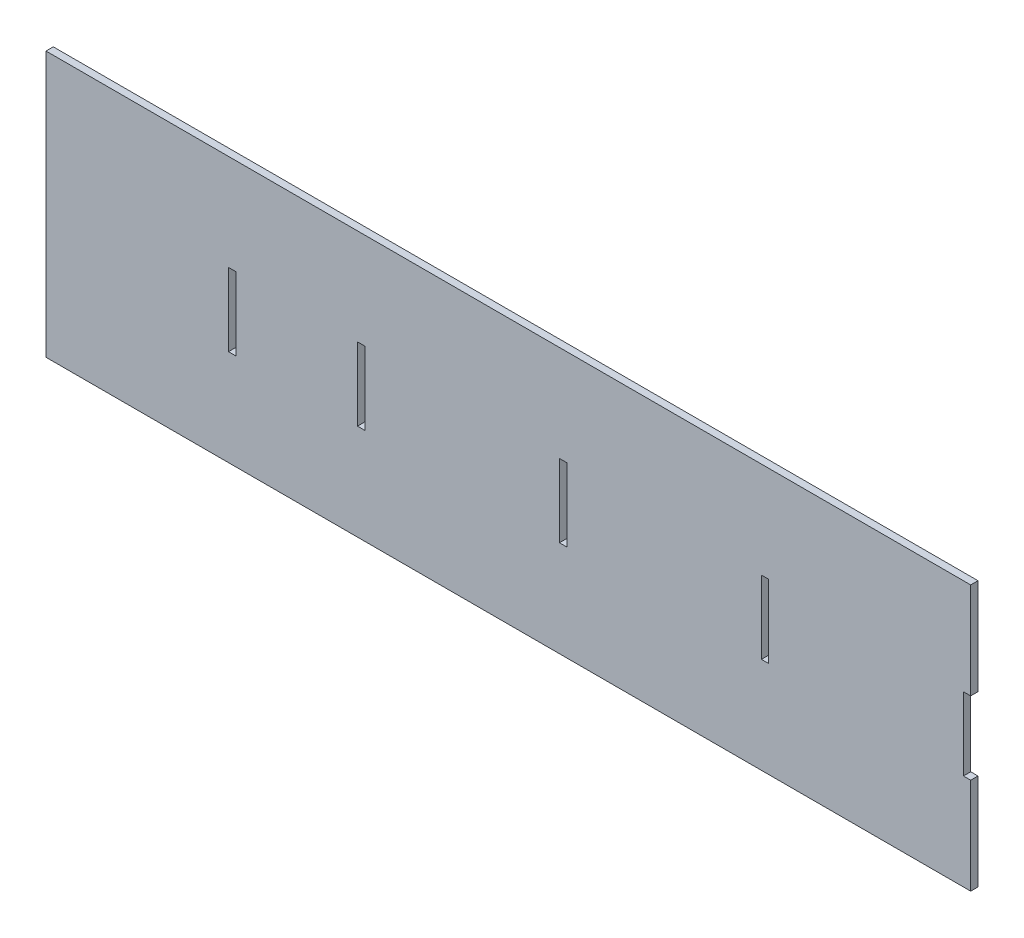
ISO-10303-21;
HEADER;
FILE_DESCRIPTION(('STEP AP214'),'2;1');
FILE_NAME('part.step','',(''),(''),'','','');
FILE_SCHEMA(('AUTOMOTIVE_DESIGN { 1 0 10303 214 1 1 1 1 }'));
ENDSEC;
DATA;
#1=APPLICATION_CONTEXT('core data for automotive mechanical design processes');
#2=APPLICATION_PROTOCOL_DEFINITION('international standard','automotive_design',2000,#1);
#3=PRODUCT_CONTEXT('',#1,'mechanical');
#4=PRODUCT('Part','Part','',(#3));
#5=PRODUCT_RELATED_PRODUCT_CATEGORY('part','',(#4));
#6=PRODUCT_DEFINITION_FORMATION('','',#4);
#7=PRODUCT_DEFINITION_CONTEXT('part definition',#1,'design');
#8=PRODUCT_DEFINITION('design','',#6,#7);
#9=PRODUCT_DEFINITION_SHAPE('','',#8);
#10=(LENGTH_UNIT() NAMED_UNIT(*) SI_UNIT(.MILLI.,.METRE.));
#11=(NAMED_UNIT(*) PLANE_ANGLE_UNIT() SI_UNIT($,.RADIAN.));
#12=(NAMED_UNIT(*) SI_UNIT($,.STERADIAN.) SOLID_ANGLE_UNIT());
#13=UNCERTAINTY_MEASURE_WITH_UNIT(LENGTH_MEASURE(1.E-05),#10,'distance_accuracy_value','');
#14=(GEOMETRIC_REPRESENTATION_CONTEXT(3) GLOBAL_UNCERTAINTY_ASSIGNED_CONTEXT((#13)) GLOBAL_UNIT_ASSIGNED_CONTEXT((#10,
#11,#12)) REPRESENTATION_CONTEXT('',''));
#15=CARTESIAN_POINT('',(0.,0.,0.));
#16=DIRECTION('',(0.,0.,1.));
#17=DIRECTION('',(1.,0.,0.));
#18=AXIS2_PLACEMENT_3D('',#15,#16,#17);
#19=CARTESIAN_POINT('',(0.,0.,3.));
#20=DIRECTION('',(0.,0.,-1.));
#21=DIRECTION('',(-1.,0.,0.));
#22=AXIS2_PLACEMENT_3D('',#19,#20,#21);
#23=PLANE('',#22);
#24=DIRECTION('',(0.,-1.,0.));
#25=VECTOR('',#24,1.);
#26=CARTESIAN_POINT('',(294.,69.5,3.));
#27=LINE('',#26,#25);
#28=CARTESIAN_POINT('',(294.,69.5,3.));
#29=VERTEX_POINT('',#28);
#30=CARTESIAN_POINT('',(294.,39.5,3.));
#31=VERTEX_POINT('',#30);
#32=EDGE_CURVE('E234',#29,#31,#27,.T.);
#33=ORIENTED_EDGE('',*,*,#32,.F.);
#34=DIRECTION('',(-1.,0.,0.));
#35=VECTOR('',#34,1.);
#36=CARTESIAN_POINT('',(294.,69.5,3.));
#37=LINE('',#36,#35);
#38=CARTESIAN_POINT('',(297.,69.5,3.));
#39=VERTEX_POINT('',#38);
#40=EDGE_CURVE('E242',#39,#29,#37,.T.);
#41=ORIENTED_EDGE('',*,*,#40,.F.);
#42=DIRECTION('',(0.,1.,0.));
#43=VECTOR('',#42,1.);
#44=CARTESIAN_POINT('',(297.,69.5,3.));
#45=LINE('',#44,#43);
#46=CARTESIAN_POINT('',(297.,39.5,3.));
#47=VERTEX_POINT('',#46);
#48=EDGE_CURVE('E239',#47,#39,#45,.T.);
#49=ORIENTED_EDGE('',*,*,#48,.F.);
#50=DIRECTION('',(1.,0.,0.));
#51=VECTOR('',#50,1.);
#52=CARTESIAN_POINT('',(294.,39.5,3.));
#53=LINE('',#52,#51);
#54=EDGE_CURVE('E236',#31,#47,#53,.T.);
#55=ORIENTED_EDGE('',*,*,#54,.F.);
#56=EDGE_LOOP('',(#33,#41,#49,#55));
#57=FACE_BOUND('',#56,.T.);
#58=DIRECTION('',(0.,-1.,0.));
#59=VECTOR('',#58,1.);
#60=CARTESIAN_POINT('',(75.,69.5,3.));
#61=LINE('',#60,#59);
#62=CARTESIAN_POINT('',(75.,69.5,3.));
#63=VERTEX_POINT('',#62);
#64=CARTESIAN_POINT('',(75.,39.5,3.));
#65=VERTEX_POINT('',#64);
#66=EDGE_CURVE('E296',#63,#65,#61,.T.);
#67=ORIENTED_EDGE('',*,*,#66,.F.);
#68=DIRECTION('',(-1.,0.,0.));
#69=VECTOR('',#68,1.);
#70=CARTESIAN_POINT('',(75.,69.5,3.));
#71=LINE('',#70,#69);
#72=CARTESIAN_POINT('',(78.,69.5,3.));
#73=VERTEX_POINT('',#72);
#74=EDGE_CURVE('E304',#73,#63,#71,.T.);
#75=ORIENTED_EDGE('',*,*,#74,.F.);
#76=DIRECTION('',(0.,1.,0.));
#77=VECTOR('',#76,1.);
#78=CARTESIAN_POINT('',(78.,69.5,3.));
#79=LINE('',#78,#77);
#80=CARTESIAN_POINT('',(78.,39.5,3.));
#81=VERTEX_POINT('',#80);
#82=EDGE_CURVE('E301',#81,#73,#79,.T.);
#83=ORIENTED_EDGE('',*,*,#82,.F.);
#84=DIRECTION('',(1.,0.,0.));
#85=VECTOR('',#84,1.);
#86=CARTESIAN_POINT('',(75.,39.5,3.));
#87=LINE('',#86,#85);
#88=EDGE_CURVE('E298',#65,#81,#87,.T.);
#89=ORIENTED_EDGE('',*,*,#88,.F.);
#90=EDGE_LOOP('',(#67,#75,#83,#89));
#91=FACE_BOUND('',#90,.T.);
#92=DIRECTION('',(0.,-1.,0.));
#93=VECTOR('',#92,1.);
#94=CARTESIAN_POINT('',(0.,0.,3.));
#95=LINE('',#94,#93);
#96=CARTESIAN_POINT('',(0.,109.,3.));
#97=VERTEX_POINT('',#96);
#98=CARTESIAN_POINT('',(0.,0.,3.));
#99=VERTEX_POINT('',#98);
#100=EDGE_CURVE('E327',#97,#99,#95,.T.);
#101=ORIENTED_EDGE('',*,*,#100,.T.);
#102=DIRECTION('',(1.,0.,0.));
#103=VECTOR('',#102,1.);
#104=CARTESIAN_POINT('',(380.,0.,3.));
#105=LINE('',#104,#103);
#106=CARTESIAN_POINT('',(380.,0.,3.));
#107=VERTEX_POINT('',#106);
#108=EDGE_CURVE('E330',#99,#107,#105,.T.);
#109=ORIENTED_EDGE('',*,*,#108,.T.);
#110=DIRECTION('',(0.,1.,0.));
#111=VECTOR('',#110,1.);
#112=CARTESIAN_POINT('',(380.,39.5,3.));
#113=LINE('',#112,#111);
#114=CARTESIAN_POINT('',(380.,39.5,3.));
#115=VERTEX_POINT('',#114);
#116=EDGE_CURVE('E333',#107,#115,#113,.T.);
#117=ORIENTED_EDGE('',*,*,#116,.T.);
#118=DIRECTION('',(-1.,0.,0.));
#119=VECTOR('',#118,1.);
#120=CARTESIAN_POINT('',(377.,39.5,3.));
#121=LINE('',#120,#119);
#122=CARTESIAN_POINT('',(377.,39.5,3.));
#123=VERTEX_POINT('',#122);
#124=EDGE_CURVE('E335',#115,#123,#121,.T.);
#125=ORIENTED_EDGE('',*,*,#124,.T.);
#126=DIRECTION('',(0.,1.,0.));
#127=VECTOR('',#126,1.);
#128=CARTESIAN_POINT('',(377.,69.5,3.));
#129=LINE('',#128,#127);
#130=CARTESIAN_POINT('',(377.,69.5,3.));
#131=VERTEX_POINT('',#130);
#132=EDGE_CURVE('E337',#123,#131,#129,.T.);
#133=ORIENTED_EDGE('',*,*,#132,.T.);
#134=DIRECTION('',(1.,0.,0.));
#135=VECTOR('',#134,1.);
#136=CARTESIAN_POINT('',(377.,69.5,3.));
#137=LINE('',#136,#135);
#138=CARTESIAN_POINT('',(380.,69.5,3.));
#139=VERTEX_POINT('',#138);
#140=EDGE_CURVE('E339',#131,#139,#137,.T.);
#141=ORIENTED_EDGE('',*,*,#140,.T.);
#142=DIRECTION('',(0.,1.,0.));
#143=VECTOR('',#142,1.);
#144=CARTESIAN_POINT('',(380.,69.5,3.));
#145=LINE('',#144,#143);
#146=CARTESIAN_POINT('',(380.,109.,3.));
#147=VERTEX_POINT('',#146);
#148=EDGE_CURVE('E341',#139,#147,#145,.T.);
#149=ORIENTED_EDGE('',*,*,#148,.T.);
#150=DIRECTION('',(-1.,0.,0.));
#151=VECTOR('',#150,1.);
#152=CARTESIAN_POINT('',(115.000000000001,109.,3.));
#153=LINE('',#152,#151);
#154=EDGE_CURVE('E343',#147,#97,#153,.T.);
#155=ORIENTED_EDGE('',*,*,#154,.T.);
#156=EDGE_LOOP('',(#101,#109,#117,#125,#133,#141,#149,#155));
#157=FACE_BOUND('',#156,.T.);
#158=DIRECTION('',(0.,-1.,0.));
#159=VECTOR('',#158,1.);
#160=CARTESIAN_POINT('',(128.,69.5,3.));
#161=LINE('',#160,#159);
#162=CARTESIAN_POINT('',(128.,69.5,3.));
#163=VERTEX_POINT('',#162);
#164=CARTESIAN_POINT('',(128.,39.5,3.));
#165=VERTEX_POINT('',#164);
#166=EDGE_CURVE('E265',#163,#165,#161,.T.);
#167=ORIENTED_EDGE('',*,*,#166,.F.);
#168=DIRECTION('',(-1.,0.,0.));
#169=VECTOR('',#168,1.);
#170=CARTESIAN_POINT('',(128.,69.5,3.));
#171=LINE('',#170,#169);
#172=CARTESIAN_POINT('',(131.,69.5,3.));
#173=VERTEX_POINT('',#172);
#174=EDGE_CURVE('E273',#173,#163,#171,.T.);
#175=ORIENTED_EDGE('',*,*,#174,.F.);
#176=DIRECTION('',(0.,1.,0.));
#177=VECTOR('',#176,1.);
#178=CARTESIAN_POINT('',(131.,69.5,3.));
#179=LINE('',#178,#177);
#180=CARTESIAN_POINT('',(131.,39.5,3.));
#181=VERTEX_POINT('',#180);
#182=EDGE_CURVE('E270',#181,#173,#179,.T.);
#183=ORIENTED_EDGE('',*,*,#182,.F.);
#184=DIRECTION('',(1.,0.,0.));
#185=VECTOR('',#184,1.);
#186=CARTESIAN_POINT('',(128.,39.5,3.));
#187=LINE('',#186,#185);
#188=EDGE_CURVE('E267',#165,#181,#187,.T.);
#189=ORIENTED_EDGE('',*,*,#188,.F.);
#190=EDGE_LOOP('',(#167,#175,#183,#189));
#191=FACE_BOUND('',#190,.T.);
#192=DIRECTION('',(0.,-1.,0.));
#193=VECTOR('',#192,1.);
#194=CARTESIAN_POINT('',(211.,69.5,3.));
#195=LINE('',#194,#193);
#196=CARTESIAN_POINT('',(211.,69.5,3.));
#197=VERTEX_POINT('',#196);
#198=CARTESIAN_POINT('',(211.,39.5,3.));
#199=VERTEX_POINT('',#198);
#200=EDGE_CURVE('E198',#197,#199,#195,.T.);
#201=ORIENTED_EDGE('',*,*,#200,.F.);
#202=DIRECTION('',(-1.,0.,0.));
#203=VECTOR('',#202,1.);
#204=CARTESIAN_POINT('',(211.,69.5,3.));
#205=LINE('',#204,#203);
#206=CARTESIAN_POINT('',(214.,69.5,3.));
#207=VERTEX_POINT('',#206);
#208=EDGE_CURVE('E220',#207,#197,#205,.T.);
#209=ORIENTED_EDGE('',*,*,#208,.F.);
#210=DIRECTION('',(0.,1.,0.));
#211=VECTOR('',#210,1.);
#212=CARTESIAN_POINT('',(214.,69.5,3.));
#213=LINE('',#212,#211);
#214=CARTESIAN_POINT('',(214.,39.5,3.));
#215=VERTEX_POINT('',#214);
#216=EDGE_CURVE('E218',#215,#207,#213,.T.);
#217=ORIENTED_EDGE('',*,*,#216,.F.);
#218=DIRECTION('',(1.,0.,0.));
#219=VECTOR('',#218,1.);
#220=CARTESIAN_POINT('',(211.,39.5,3.));
#221=LINE('',#220,#219);
#222=EDGE_CURVE('E206',#199,#215,#221,.T.);
#223=ORIENTED_EDGE('',*,*,#222,.F.);
#224=EDGE_LOOP('',(#201,#209,#217,#223));
#225=FACE_BOUND('',#224,.T.);
#226=ADVANCED_FACE('F37',(#57,#91,#157,#191,#225),#23,.F.);
#227=CARTESIAN_POINT('',(0.,0.,0.));
#228=DIRECTION('',(0.,0.,-1.));
#229=DIRECTION('',(-1.,0.,0.));
#230=AXIS2_PLACEMENT_3D('',#227,#228,#229);
#231=PLANE('',#230);
#232=DIRECTION('',(0.,-1.,0.));
#233=VECTOR('',#232,1.);
#234=CARTESIAN_POINT('',(0.,0.,0.));
#235=LINE('',#234,#233);
#236=CARTESIAN_POINT('',(0.,109.,0.));
#237=VERTEX_POINT('',#236);
#238=CARTESIAN_POINT('',(0.,0.,0.));
#239=VERTEX_POINT('',#238);
#240=EDGE_CURVE('E326',#237,#239,#235,.T.);
#241=ORIENTED_EDGE('',*,*,#240,.F.);
#242=DIRECTION('',(-1.,0.,0.));
#243=VECTOR('',#242,1.);
#244=CARTESIAN_POINT('',(0.,109.,0.));
#245=LINE('',#244,#243);
#246=CARTESIAN_POINT('',(380.,109.,0.));
#247=VERTEX_POINT('',#246);
#248=EDGE_CURVE('E331',#247,#237,#245,.T.);
#249=ORIENTED_EDGE('',*,*,#248,.F.);
#250=DIRECTION('',(0.,1.,0.));
#251=VECTOR('',#250,1.);
#252=CARTESIAN_POINT('',(380.,69.5,0.));
#253=LINE('',#252,#251);
#254=CARTESIAN_POINT('',(380.,69.5,0.));
#255=VERTEX_POINT('',#254);
#256=EDGE_CURVE('E358',#255,#247,#253,.T.);
#257=ORIENTED_EDGE('',*,*,#256,.F.);
#258=DIRECTION('',(1.,0.,0.));
#259=VECTOR('',#258,1.);
#260=CARTESIAN_POINT('',(377.,69.5,0.));
#261=LINE('',#260,#259);
#262=CARTESIAN_POINT('',(377.,69.5,0.));
#263=VERTEX_POINT('',#262);
#264=EDGE_CURVE('E356',#263,#255,#261,.T.);
#265=ORIENTED_EDGE('',*,*,#264,.F.);
#266=DIRECTION('',(0.,1.,0.));
#267=VECTOR('',#266,1.);
#268=CARTESIAN_POINT('',(377.,69.5,0.));
#269=LINE('',#268,#267);
#270=CARTESIAN_POINT('',(377.,39.5,0.));
#271=VERTEX_POINT('',#270);
#272=EDGE_CURVE('E354',#271,#263,#269,.T.);
#273=ORIENTED_EDGE('',*,*,#272,.F.);
#274=DIRECTION('',(-1.,0.,0.));
#275=VECTOR('',#274,1.);
#276=CARTESIAN_POINT('',(377.,39.5,0.));
#277=LINE('',#276,#275);
#278=CARTESIAN_POINT('',(380.,39.5,0.));
#279=VERTEX_POINT('',#278);
#280=EDGE_CURVE('E352',#279,#271,#277,.T.);
#281=ORIENTED_EDGE('',*,*,#280,.F.);
#282=DIRECTION('',(0.,1.,0.));
#283=VECTOR('',#282,1.);
#284=CARTESIAN_POINT('',(380.,39.5,0.));
#285=LINE('',#284,#283);
#286=CARTESIAN_POINT('',(380.,0.,0.));
#287=VERTEX_POINT('',#286);
#288=EDGE_CURVE('E350',#287,#279,#285,.T.);
#289=ORIENTED_EDGE('',*,*,#288,.F.);
#290=DIRECTION('',(1.,0.,0.));
#291=VECTOR('',#290,1.);
#292=CARTESIAN_POINT('',(380.,0.,0.));
#293=LINE('',#292,#291);
#294=EDGE_CURVE('E348',#239,#287,#293,.T.);
#295=ORIENTED_EDGE('',*,*,#294,.F.);
#296=EDGE_LOOP('',(#241,#249,#257,#265,#273,#281,#289,#295));
#297=FACE_BOUND('',#296,.T.);
#298=DIRECTION('',(-1.,0.,0.));
#299=VECTOR('',#298,1.);
#300=CARTESIAN_POINT('',(75.,69.5,0.));
#301=LINE('',#300,#299);
#302=CARTESIAN_POINT('',(78.,69.5,0.));
#303=VERTEX_POINT('',#302);
#304=CARTESIAN_POINT('',(75.,69.5,0.));
#305=VERTEX_POINT('',#304);
#306=EDGE_CURVE('E299',#303,#305,#301,.T.);
#307=ORIENTED_EDGE('',*,*,#306,.T.);
#308=DIRECTION('',(0.,-1.,0.));
#309=VECTOR('',#308,1.);
#310=CARTESIAN_POINT('',(75.,69.5,0.));
#311=LINE('',#310,#309);
#312=CARTESIAN_POINT('',(75.,39.5,0.));
#313=VERTEX_POINT('',#312);
#314=EDGE_CURVE('E295',#305,#313,#311,.T.);
#315=ORIENTED_EDGE('',*,*,#314,.T.);
#316=DIRECTION('',(1.,0.,0.));
#317=VECTOR('',#316,1.);
#318=CARTESIAN_POINT('',(75.,39.5,0.));
#319=LINE('',#318,#317);
#320=CARTESIAN_POINT('',(78.,39.5,0.));
#321=VERTEX_POINT('',#320);
#322=EDGE_CURVE('E309',#313,#321,#319,.T.);
#323=ORIENTED_EDGE('',*,*,#322,.T.);
#324=DIRECTION('',(0.,1.,0.));
#325=VECTOR('',#324,1.);
#326=CARTESIAN_POINT('',(78.,69.5,0.));
#327=LINE('',#326,#325);
#328=EDGE_CURVE('E312',#321,#303,#327,.T.);
#329=ORIENTED_EDGE('',*,*,#328,.T.);
#330=EDGE_LOOP('',(#307,#315,#323,#329));
#331=FACE_BOUND('',#330,.T.);
#332=DIRECTION('',(-1.,0.,0.));
#333=VECTOR('',#332,1.);
#334=CARTESIAN_POINT('',(128.,69.5,0.));
#335=LINE('',#334,#333);
#336=CARTESIAN_POINT('',(131.,69.5,0.));
#337=VERTEX_POINT('',#336);
#338=CARTESIAN_POINT('',(128.,69.5,0.));
#339=VERTEX_POINT('',#338);
#340=EDGE_CURVE('E268',#337,#339,#335,.T.);
#341=ORIENTED_EDGE('',*,*,#340,.T.);
#342=DIRECTION('',(0.,-1.,0.));
#343=VECTOR('',#342,1.);
#344=CARTESIAN_POINT('',(128.,69.5,0.));
#345=LINE('',#344,#343);
#346=CARTESIAN_POINT('',(128.,39.5,0.));
#347=VERTEX_POINT('',#346);
#348=EDGE_CURVE('E264',#339,#347,#345,.T.);
#349=ORIENTED_EDGE('',*,*,#348,.T.);
#350=DIRECTION('',(1.,0.,0.));
#351=VECTOR('',#350,1.);
#352=CARTESIAN_POINT('',(128.,39.5,0.));
#353=LINE('',#352,#351);
#354=CARTESIAN_POINT('',(131.,39.5,0.));
#355=VERTEX_POINT('',#354);
#356=EDGE_CURVE('E278',#347,#355,#353,.T.);
#357=ORIENTED_EDGE('',*,*,#356,.T.);
#358=DIRECTION('',(0.,1.,0.));
#359=VECTOR('',#358,1.);
#360=CARTESIAN_POINT('',(131.,69.5,0.));
#361=LINE('',#360,#359);
#362=EDGE_CURVE('E281',#355,#337,#361,.T.);
#363=ORIENTED_EDGE('',*,*,#362,.T.);
#364=EDGE_LOOP('',(#341,#349,#357,#363));
#365=FACE_BOUND('',#364,.T.);
#366=DIRECTION('',(-1.,0.,0.));
#367=VECTOR('',#366,1.);
#368=CARTESIAN_POINT('',(294.,69.5,0.));
#369=LINE('',#368,#367);
#370=CARTESIAN_POINT('',(297.,69.5,0.));
#371=VERTEX_POINT('',#370);
#372=CARTESIAN_POINT('',(294.,69.5,0.));
#373=VERTEX_POINT('',#372);
#374=EDGE_CURVE('E237',#371,#373,#369,.T.);
#375=ORIENTED_EDGE('',*,*,#374,.T.);
#376=DIRECTION('',(0.,-1.,0.));
#377=VECTOR('',#376,1.);
#378=CARTESIAN_POINT('',(294.,69.5,0.));
#379=LINE('',#378,#377);
#380=CARTESIAN_POINT('',(294.,39.5,0.));
#381=VERTEX_POINT('',#380);
#382=EDGE_CURVE('E214',#373,#381,#379,.T.);
#383=ORIENTED_EDGE('',*,*,#382,.T.);
#384=DIRECTION('',(1.,0.,0.));
#385=VECTOR('',#384,1.);
#386=CARTESIAN_POINT('',(294.,39.5,0.));
#387=LINE('',#386,#385);
#388=CARTESIAN_POINT('',(297.,39.5,0.));
#389=VERTEX_POINT('',#388);
#390=EDGE_CURVE('E247',#381,#389,#387,.T.);
#391=ORIENTED_EDGE('',*,*,#390,.T.);
#392=DIRECTION('',(0.,1.,0.));
#393=VECTOR('',#392,1.);
#394=CARTESIAN_POINT('',(297.,69.5,0.));
#395=LINE('',#394,#393);
#396=EDGE_CURVE('E250',#389,#371,#395,.T.);
#397=ORIENTED_EDGE('',*,*,#396,.T.);
#398=EDGE_LOOP('',(#375,#383,#391,#397));
#399=FACE_BOUND('',#398,.T.);
#400=DIRECTION('',(-1.,0.,0.));
#401=VECTOR('',#400,1.);
#402=CARTESIAN_POINT('',(211.,69.5,0.));
#403=LINE('',#402,#401);
#404=CARTESIAN_POINT('',(214.,69.5,0.));
#405=VERTEX_POINT('',#404);
#406=CARTESIAN_POINT('',(211.,69.5,0.));
#407=VERTEX_POINT('',#406);
#408=EDGE_CURVE('E207',#405,#407,#403,.T.);
#409=ORIENTED_EDGE('',*,*,#408,.T.);
#410=DIRECTION('',(0.,-1.,0.));
#411=VECTOR('',#410,1.);
#412=CARTESIAN_POINT('',(211.,69.5,0.));
#413=LINE('',#412,#411);
#414=CARTESIAN_POINT('',(211.,39.5,0.));
#415=VERTEX_POINT('',#414);
#416=EDGE_CURVE('E60',#407,#415,#413,.T.);
#417=ORIENTED_EDGE('',*,*,#416,.T.);
#418=DIRECTION('',(1.,0.,0.));
#419=VECTOR('',#418,1.);
#420=CARTESIAN_POINT('',(211.,39.5,0.));
#421=LINE('',#420,#419);
#422=CARTESIAN_POINT('',(214.,39.5,0.));
#423=VERTEX_POINT('',#422);
#424=EDGE_CURVE('E213',#415,#423,#421,.T.);
#425=ORIENTED_EDGE('',*,*,#424,.T.);
#426=DIRECTION('',(0.,1.,0.));
#427=VECTOR('',#426,1.);
#428=CARTESIAN_POINT('',(214.,69.5,0.));
#429=LINE('',#428,#427);
#430=EDGE_CURVE('E226',#423,#405,#429,.T.);
#431=ORIENTED_EDGE('',*,*,#430,.T.);
#432=EDGE_LOOP('',(#409,#417,#425,#431));
#433=FACE_BOUND('',#432,.T.);
#434=ADVANCED_FACE('F389',(#297,#331,#365,#399,#433),#231,.T.);
#435=CARTESIAN_POINT('',(0.,0.,3.));
#436=DIRECTION('',(1.,0.,0.));
#437=DIRECTION('',(0.,1.,0.));
#438=AXIS2_PLACEMENT_3D('',#435,#436,#437);
#439=PLANE('',#438);
#440=ORIENTED_EDGE('',*,*,#240,.T.);
#441=DIRECTION('',(0.,0.,-1.));
#442=VECTOR('',#441,1.);
#443=CARTESIAN_POINT('',(0.,0.,3.));
#444=LINE('',#443,#442);
#445=EDGE_CURVE('E11',#99,#239,#444,.T.);
#446=ORIENTED_EDGE('',*,*,#445,.F.);
#447=ORIENTED_EDGE('',*,*,#100,.F.);
#448=DIRECTION('',(0.,0.,-1.));
#449=VECTOR('',#448,1.);
#450=CARTESIAN_POINT('',(0.,109.,3.));
#451=LINE('',#450,#449);
#452=EDGE_CURVE('E345',#97,#237,#451,.T.);
#453=ORIENTED_EDGE('',*,*,#452,.T.);
#454=EDGE_LOOP('',(#440,#446,#447,#453));
#455=FACE_BOUND('',#454,.T.);
#456=ADVANCED_FACE('F39',(#455),#439,.F.);
#457=CARTESIAN_POINT('',(380.,0.,3.));
#458=DIRECTION('',(0.,1.,0.));
#459=DIRECTION('',(-1.,0.,0.));
#460=AXIS2_PLACEMENT_3D('',#457,#458,#459);
#461=PLANE('',#460);
#462=ORIENTED_EDGE('',*,*,#294,.T.);
#463=DIRECTION('',(0.,0.,-1.));
#464=VECTOR('',#463,1.);
#465=CARTESIAN_POINT('',(380.,0.,3.));
#466=LINE('',#465,#464);
#467=EDGE_CURVE('E45',#107,#287,#466,.T.);
#468=ORIENTED_EDGE('',*,*,#467,.F.);
#469=ORIENTED_EDGE('',*,*,#108,.F.);
#470=ORIENTED_EDGE('',*,*,#445,.T.);
#471=EDGE_LOOP('',(#462,#468,#469,#470));
#472=FACE_BOUND('',#471,.T.);
#473=ADVANCED_FACE('F407',(#472),#461,.F.);
#474=CARTESIAN_POINT('',(380.,39.5,3.));
#475=DIRECTION('',(-1.,0.,0.));
#476=DIRECTION('',(0.,0.,1.));
#477=AXIS2_PLACEMENT_3D('',#474,#475,#476);
#478=PLANE('',#477);
#479=ORIENTED_EDGE('',*,*,#288,.T.);
#480=DIRECTION('',(0.,0.,-1.));
#481=VECTOR('',#480,1.);
#482=CARTESIAN_POINT('',(380.,39.5,3.));
#483=LINE('',#482,#481);
#484=EDGE_CURVE('E376',#115,#279,#483,.T.);
#485=ORIENTED_EDGE('',*,*,#484,.F.);
#486=ORIENTED_EDGE('',*,*,#116,.F.);
#487=ORIENTED_EDGE('',*,*,#467,.T.);
#488=EDGE_LOOP('',(#479,#485,#486,#487));
#489=FACE_BOUND('',#488,.T.);
#490=ADVANCED_FACE('F383',(#489),#478,.F.);
#491=CARTESIAN_POINT('',(377.,39.5,3.));
#492=DIRECTION('',(0.,-1.,0.));
#493=DIRECTION('',(1.,0.,0.));
#494=AXIS2_PLACEMENT_3D('',#491,#492,#493);
#495=PLANE('',#494);
#496=ORIENTED_EDGE('',*,*,#280,.T.);
#497=DIRECTION('',(0.,0.,-1.));
#498=VECTOR('',#497,1.);
#499=CARTESIAN_POINT('',(377.,39.5,3.));
#500=LINE('',#499,#498);
#501=EDGE_CURVE('E373',#123,#271,#500,.T.);
#502=ORIENTED_EDGE('',*,*,#501,.F.);
#503=ORIENTED_EDGE('',*,*,#124,.F.);
#504=ORIENTED_EDGE('',*,*,#484,.T.);
#505=EDGE_LOOP('',(#496,#502,#503,#504));
#506=FACE_BOUND('',#505,.T.);
#507=ADVANCED_FACE('F395',(#506),#495,.F.);
#508=CARTESIAN_POINT('',(377.,69.5,3.));
#509=DIRECTION('',(-1.,0.,0.));
#510=DIRECTION('',(0.,0.,1.));
#511=AXIS2_PLACEMENT_3D('',#508,#509,#510);
#512=PLANE('',#511);
#513=ORIENTED_EDGE('',*,*,#272,.T.);
#514=DIRECTION('',(0.,0.,-1.));
#515=VECTOR('',#514,1.);
#516=CARTESIAN_POINT('',(377.,69.5,3.));
#517=LINE('',#516,#515);
#518=EDGE_CURVE('E370',#131,#263,#517,.T.);
#519=ORIENTED_EDGE('',*,*,#518,.F.);
#520=ORIENTED_EDGE('',*,*,#132,.F.);
#521=ORIENTED_EDGE('',*,*,#501,.T.);
#522=EDGE_LOOP('',(#513,#519,#520,#521));
#523=FACE_BOUND('',#522,.T.);
#524=ADVANCED_FACE('F399',(#523),#512,.F.);
#525=CARTESIAN_POINT('',(377.,69.5,3.));
#526=DIRECTION('',(0.,1.,0.));
#527=DIRECTION('',(-1.,0.,0.));
#528=AXIS2_PLACEMENT_3D('',#525,#526,#527);
#529=PLANE('',#528);
#530=ORIENTED_EDGE('',*,*,#264,.T.);
#531=DIRECTION('',(0.,0.,-1.));
#532=VECTOR('',#531,1.);
#533=CARTESIAN_POINT('',(380.,69.5,3.));
#534=LINE('',#533,#532);
#535=EDGE_CURVE('E367',#139,#255,#534,.T.);
#536=ORIENTED_EDGE('',*,*,#535,.F.);
#537=ORIENTED_EDGE('',*,*,#140,.F.);
#538=ORIENTED_EDGE('',*,*,#518,.T.);
#539=EDGE_LOOP('',(#530,#536,#537,#538));
#540=FACE_BOUND('',#539,.T.);
#541=ADVANCED_FACE('F428',(#540),#529,.F.);
#542=CARTESIAN_POINT('',(380.,69.5,3.));
#543=DIRECTION('',(-1.,0.,0.));
#544=DIRECTION('',(0.,0.,1.));
#545=AXIS2_PLACEMENT_3D('',#542,#543,#544);
#546=PLANE('',#545);
#547=ORIENTED_EDGE('',*,*,#256,.T.);
#548=DIRECTION('',(0.,0.,-1.));
#549=VECTOR('',#548,1.);
#550=CARTESIAN_POINT('',(380.,109.,3.));
#551=LINE('',#550,#549);
#552=EDGE_CURVE('E364',#147,#247,#551,.T.);
#553=ORIENTED_EDGE('',*,*,#552,.F.);
#554=ORIENTED_EDGE('',*,*,#148,.F.);
#555=ORIENTED_EDGE('',*,*,#535,.T.);
#556=EDGE_LOOP('',(#547,#553,#554,#555));
#557=FACE_BOUND('',#556,.T.);
#558=ADVANCED_FACE('F414',(#557),#546,.F.);
#559=CARTESIAN_POINT('',(0.,109.,3.));
#560=DIRECTION('',(0.,-1.,0.));
#561=DIRECTION('',(0.,0.,-1.));
#562=AXIS2_PLACEMENT_3D('',#559,#560,#561);
#563=PLANE('',#562);
#564=ORIENTED_EDGE('',*,*,#248,.T.);
#565=ORIENTED_EDGE('',*,*,#452,.F.);
#566=ORIENTED_EDGE('',*,*,#154,.F.);
#567=ORIENTED_EDGE('',*,*,#552,.T.);
#568=EDGE_LOOP('',(#564,#565,#566,#567));
#569=FACE_BOUND('',#568,.T.);
#570=ADVANCED_FACE('F417',(#569),#563,.F.);
#571=CARTESIAN_POINT('',(75.,69.5,3.));
#572=DIRECTION('',(1.,0.,0.));
#573=DIRECTION('',(0.,0.,-1.));
#574=AXIS2_PLACEMENT_3D('',#571,#572,#573);
#575=PLANE('',#574);
#576=ORIENTED_EDGE('',*,*,#314,.F.);
#577=DIRECTION('',(0.,0.,-1.));
#578=VECTOR('',#577,1.);
#579=CARTESIAN_POINT('',(75.,69.5,3.));
#580=LINE('',#579,#578);
#581=EDGE_CURVE('E306',#63,#305,#580,.T.);
#582=ORIENTED_EDGE('',*,*,#581,.F.);
#583=ORIENTED_EDGE('',*,*,#66,.T.);
#584=DIRECTION('',(0.,0.,-1.));
#585=VECTOR('',#584,1.);
#586=CARTESIAN_POINT('',(75.,39.5,3.));
#587=LINE('',#586,#585);
#588=EDGE_CURVE('E323',#65,#313,#587,.T.);
#589=ORIENTED_EDGE('',*,*,#588,.T.);
#590=EDGE_LOOP('',(#576,#582,#583,#589));
#591=FACE_BOUND('',#590,.T.);
#592=ADVANCED_FACE('F419',(#591),#575,.T.);
#593=CARTESIAN_POINT('',(75.,39.5,3.));
#594=DIRECTION('',(0.,1.,0.));
#595=DIRECTION('',(0.,0.,1.));
#596=AXIS2_PLACEMENT_3D('',#593,#594,#595);
#597=PLANE('',#596);
#598=ORIENTED_EDGE('',*,*,#322,.F.);
#599=ORIENTED_EDGE('',*,*,#588,.F.);
#600=ORIENTED_EDGE('',*,*,#88,.T.);
#601=DIRECTION('',(0.,0.,-1.));
#602=VECTOR('',#601,1.);
#603=CARTESIAN_POINT('',(78.,39.5,3.));
#604=LINE('',#603,#602);
#605=EDGE_CURVE('E321',#81,#321,#604,.T.);
#606=ORIENTED_EDGE('',*,*,#605,.T.);
#607=EDGE_LOOP('',(#598,#599,#600,#606));
#608=FACE_BOUND('',#607,.T.);
#609=ADVANCED_FACE('F425',(#608),#597,.T.);
#610=CARTESIAN_POINT('',(78.,69.5,3.));
#611=DIRECTION('',(-1.,0.,0.));
#612=DIRECTION('',(0.,0.,1.));
#613=AXIS2_PLACEMENT_3D('',#610,#611,#612);
#614=PLANE('',#613);
#615=ORIENTED_EDGE('',*,*,#328,.F.);
#616=ORIENTED_EDGE('',*,*,#605,.F.);
#617=ORIENTED_EDGE('',*,*,#82,.T.);
#618=DIRECTION('',(0.,0.,-1.));
#619=VECTOR('',#618,1.);
#620=CARTESIAN_POINT('',(78.,69.5,3.));
#621=LINE('',#620,#619);
#622=EDGE_CURVE('E319',#73,#303,#621,.T.);
#623=ORIENTED_EDGE('',*,*,#622,.T.);
#624=EDGE_LOOP('',(#615,#616,#617,#623));
#625=FACE_BOUND('',#624,.T.);
#626=ADVANCED_FACE('F442',(#625),#614,.T.);
#627=CARTESIAN_POINT('',(75.,69.5,3.));
#628=DIRECTION('',(0.,-1.,0.));
#629=DIRECTION('',(0.,0.,-1.));
#630=AXIS2_PLACEMENT_3D('',#627,#628,#629);
#631=PLANE('',#630);
#632=ORIENTED_EDGE('',*,*,#306,.F.);
#633=ORIENTED_EDGE('',*,*,#622,.F.);
#634=ORIENTED_EDGE('',*,*,#74,.T.);
#635=ORIENTED_EDGE('',*,*,#581,.T.);
#636=EDGE_LOOP('',(#632,#633,#634,#635));
#637=FACE_BOUND('',#636,.T.);
#638=ADVANCED_FACE('F446',(#637),#631,.T.);
#639=CARTESIAN_POINT('',(128.,69.5,3.));
#640=DIRECTION('',(1.,0.,0.));
#641=DIRECTION('',(0.,0.,-1.));
#642=AXIS2_PLACEMENT_3D('',#639,#640,#641);
#643=PLANE('',#642);
#644=ORIENTED_EDGE('',*,*,#348,.F.);
#645=DIRECTION('',(0.,0.,-1.));
#646=VECTOR('',#645,1.);
#647=CARTESIAN_POINT('',(128.,69.5,3.));
#648=LINE('',#647,#646);
#649=EDGE_CURVE('E275',#163,#339,#648,.T.);
#650=ORIENTED_EDGE('',*,*,#649,.F.);
#651=ORIENTED_EDGE('',*,*,#166,.T.);
#652=DIRECTION('',(0.,0.,-1.));
#653=VECTOR('',#652,1.);
#654=CARTESIAN_POINT('',(128.,39.5,3.));
#655=LINE('',#654,#653);
#656=EDGE_CURVE('E292',#165,#347,#655,.T.);
#657=ORIENTED_EDGE('',*,*,#656,.T.);
#658=EDGE_LOOP('',(#644,#650,#651,#657));
#659=FACE_BOUND('',#658,.T.);
#660=ADVANCED_FACE('F450',(#659),#643,.T.);
#661=CARTESIAN_POINT('',(128.,39.5,3.));
#662=DIRECTION('',(0.,1.,0.));
#663=DIRECTION('',(0.,0.,1.));
#664=AXIS2_PLACEMENT_3D('',#661,#662,#663);
#665=PLANE('',#664);
#666=ORIENTED_EDGE('',*,*,#356,.F.);
#667=ORIENTED_EDGE('',*,*,#656,.F.);
#668=ORIENTED_EDGE('',*,*,#188,.T.);
#669=DIRECTION('',(0.,0.,-1.));
#670=VECTOR('',#669,1.);
#671=CARTESIAN_POINT('',(131.,39.5,3.));
#672=LINE('',#671,#670);
#673=EDGE_CURVE('E290',#181,#355,#672,.T.);
#674=ORIENTED_EDGE('',*,*,#673,.T.);
#675=EDGE_LOOP('',(#666,#667,#668,#674));
#676=FACE_BOUND('',#675,.T.);
#677=ADVANCED_FACE('F454',(#676),#665,.T.);
#678=CARTESIAN_POINT('',(131.,69.5,3.));
#679=DIRECTION('',(-1.,0.,0.));
#680=DIRECTION('',(0.,0.,1.));
#681=AXIS2_PLACEMENT_3D('',#678,#679,#680);
#682=PLANE('',#681);
#683=ORIENTED_EDGE('',*,*,#362,.F.);
#684=ORIENTED_EDGE('',*,*,#673,.F.);
#685=ORIENTED_EDGE('',*,*,#182,.T.);
#686=DIRECTION('',(0.,0.,-1.));
#687=VECTOR('',#686,1.);
#688=CARTESIAN_POINT('',(131.,69.5,3.));
#689=LINE('',#688,#687);
#690=EDGE_CURVE('E288',#173,#337,#689,.T.);
#691=ORIENTED_EDGE('',*,*,#690,.T.);
#692=EDGE_LOOP('',(#683,#684,#685,#691));
#693=FACE_BOUND('',#692,.T.);
#694=ADVANCED_FACE('F458',(#693),#682,.T.);
#695=CARTESIAN_POINT('',(128.,69.5,3.));
#696=DIRECTION('',(0.,-1.,0.));
#697=DIRECTION('',(0.,0.,-1.));
#698=AXIS2_PLACEMENT_3D('',#695,#696,#697);
#699=PLANE('',#698);
#700=ORIENTED_EDGE('',*,*,#340,.F.);
#701=ORIENTED_EDGE('',*,*,#690,.F.);
#702=ORIENTED_EDGE('',*,*,#174,.T.);
#703=ORIENTED_EDGE('',*,*,#649,.T.);
#704=EDGE_LOOP('',(#700,#701,#702,#703));
#705=FACE_BOUND('',#704,.T.);
#706=ADVANCED_FACE('F462',(#705),#699,.T.);
#707=CARTESIAN_POINT('',(294.,69.5,3.));
#708=DIRECTION('',(1.,0.,0.));
#709=DIRECTION('',(0.,0.,-1.));
#710=AXIS2_PLACEMENT_3D('',#707,#708,#709);
#711=PLANE('',#710);
#712=ORIENTED_EDGE('',*,*,#382,.F.);
#713=DIRECTION('',(0.,0.,-1.));
#714=VECTOR('',#713,1.);
#715=CARTESIAN_POINT('',(294.,69.5,3.));
#716=LINE('',#715,#714);
#717=EDGE_CURVE('E244',#29,#373,#716,.T.);
#718=ORIENTED_EDGE('',*,*,#717,.F.);
#719=ORIENTED_EDGE('',*,*,#32,.T.);
#720=DIRECTION('',(0.,0.,-1.));
#721=VECTOR('',#720,1.);
#722=CARTESIAN_POINT('',(294.,39.5,3.));
#723=LINE('',#722,#721);
#724=EDGE_CURVE('E261',#31,#381,#723,.T.);
#725=ORIENTED_EDGE('',*,*,#724,.T.);
#726=EDGE_LOOP('',(#712,#718,#719,#725));
#727=FACE_BOUND('',#726,.T.);
#728=ADVANCED_FACE('F466',(#727),#711,.T.);
#729=CARTESIAN_POINT('',(294.,39.5,3.));
#730=DIRECTION('',(0.,1.,0.));
#731=DIRECTION('',(0.,0.,1.));
#732=AXIS2_PLACEMENT_3D('',#729,#730,#731);
#733=PLANE('',#732);
#734=ORIENTED_EDGE('',*,*,#390,.F.);
#735=ORIENTED_EDGE('',*,*,#724,.F.);
#736=ORIENTED_EDGE('',*,*,#54,.T.);
#737=DIRECTION('',(0.,0.,-1.));
#738=VECTOR('',#737,1.);
#739=CARTESIAN_POINT('',(297.,39.5,3.));
#740=LINE('',#739,#738);
#741=EDGE_CURVE('E259',#47,#389,#740,.T.);
#742=ORIENTED_EDGE('',*,*,#741,.T.);
#743=EDGE_LOOP('',(#734,#735,#736,#742));
#744=FACE_BOUND('',#743,.T.);
#745=ADVANCED_FACE('F470',(#744),#733,.T.);
#746=CARTESIAN_POINT('',(297.,69.5,3.));
#747=DIRECTION('',(-1.,0.,0.));
#748=DIRECTION('',(0.,0.,1.));
#749=AXIS2_PLACEMENT_3D('',#746,#747,#748);
#750=PLANE('',#749);
#751=ORIENTED_EDGE('',*,*,#396,.F.);
#752=ORIENTED_EDGE('',*,*,#741,.F.);
#753=ORIENTED_EDGE('',*,*,#48,.T.);
#754=DIRECTION('',(0.,0.,-1.));
#755=VECTOR('',#754,1.);
#756=CARTESIAN_POINT('',(297.,69.5,3.));
#757=LINE('',#756,#755);
#758=EDGE_CURVE('E257',#39,#371,#757,.T.);
#759=ORIENTED_EDGE('',*,*,#758,.T.);
#760=EDGE_LOOP('',(#751,#752,#753,#759));
#761=FACE_BOUND('',#760,.T.);
#762=ADVANCED_FACE('F474',(#761),#750,.T.);
#763=CARTESIAN_POINT('',(294.,69.5,3.));
#764=DIRECTION('',(0.,-1.,0.));
#765=DIRECTION('',(0.,0.,-1.));
#766=AXIS2_PLACEMENT_3D('',#763,#764,#765);
#767=PLANE('',#766);
#768=ORIENTED_EDGE('',*,*,#374,.F.);
#769=ORIENTED_EDGE('',*,*,#758,.F.);
#770=ORIENTED_EDGE('',*,*,#40,.T.);
#771=ORIENTED_EDGE('',*,*,#717,.T.);
#772=EDGE_LOOP('',(#768,#769,#770,#771));
#773=FACE_BOUND('',#772,.T.);
#774=ADVANCED_FACE('F478',(#773),#767,.T.);
#775=CARTESIAN_POINT('',(211.,69.5,3.));
#776=DIRECTION('',(1.,0.,0.));
#777=DIRECTION('',(0.,0.,-1.));
#778=AXIS2_PLACEMENT_3D('',#775,#776,#777);
#779=PLANE('',#778);
#780=ORIENTED_EDGE('',*,*,#416,.F.);
#781=DIRECTION('',(0.,0.,-1.));
#782=VECTOR('',#781,1.);
#783=CARTESIAN_POINT('',(211.,69.5,3.));
#784=LINE('',#783,#782);
#785=EDGE_CURVE('E202',#197,#407,#784,.T.);
#786=ORIENTED_EDGE('',*,*,#785,.F.);
#787=ORIENTED_EDGE('',*,*,#200,.T.);
#788=DIRECTION('',(0.,0.,-1.));
#789=VECTOR('',#788,1.);
#790=CARTESIAN_POINT('',(211.,39.5,3.));
#791=LINE('',#790,#789);
#792=EDGE_CURVE('E201',#199,#415,#791,.T.);
#793=ORIENTED_EDGE('',*,*,#792,.T.);
#794=EDGE_LOOP('',(#780,#786,#787,#793));
#795=FACE_BOUND('',#794,.T.);
#796=ADVANCED_FACE('F200',(#795),#779,.T.);
#797=CARTESIAN_POINT('',(211.,39.5,3.));
#798=DIRECTION('',(0.,1.,0.));
#799=DIRECTION('',(0.,0.,1.));
#800=AXIS2_PLACEMENT_3D('',#797,#798,#799);
#801=PLANE('',#800);
#802=ORIENTED_EDGE('',*,*,#424,.F.);
#803=ORIENTED_EDGE('',*,*,#792,.F.);
#804=ORIENTED_EDGE('',*,*,#222,.T.);
#805=DIRECTION('',(0.,0.,-1.));
#806=VECTOR('',#805,1.);
#807=CARTESIAN_POINT('',(214.,39.5,3.));
#808=LINE('',#807,#806);
#809=EDGE_CURVE('E215',#215,#423,#808,.T.);
#810=ORIENTED_EDGE('',*,*,#809,.T.);
#811=EDGE_LOOP('',(#802,#803,#804,#810));
#812=FACE_BOUND('',#811,.T.);
#813=ADVANCED_FACE('F210',(#812),#801,.T.);
#814=CARTESIAN_POINT('',(214.,69.5,3.));
#815=DIRECTION('',(-1.,0.,0.));
#816=DIRECTION('',(0.,0.,1.));
#817=AXIS2_PLACEMENT_3D('',#814,#815,#816);
#818=PLANE('',#817);
#819=ORIENTED_EDGE('',*,*,#430,.F.);
#820=ORIENTED_EDGE('',*,*,#809,.F.);
#821=ORIENTED_EDGE('',*,*,#216,.T.);
#822=DIRECTION('',(0.,0.,-1.));
#823=VECTOR('',#822,1.);
#824=CARTESIAN_POINT('',(214.,69.5,3.));
#825=LINE('',#824,#823);
#826=EDGE_CURVE('E52',#207,#405,#825,.T.);
#827=ORIENTED_EDGE('',*,*,#826,.T.);
#828=EDGE_LOOP('',(#819,#820,#821,#827));
#829=FACE_BOUND('',#828,.T.);
#830=ADVANCED_FACE('F487',(#829),#818,.T.);
#831=CARTESIAN_POINT('',(211.,69.5,3.));
#832=DIRECTION('',(0.,-1.,0.));
#833=DIRECTION('',(0.,0.,-1.));
#834=AXIS2_PLACEMENT_3D('',#831,#832,#833);
#835=PLANE('',#834);
#836=ORIENTED_EDGE('',*,*,#408,.F.);
#837=ORIENTED_EDGE('',*,*,#826,.F.);
#838=ORIENTED_EDGE('',*,*,#208,.T.);
#839=ORIENTED_EDGE('',*,*,#785,.T.);
#840=EDGE_LOOP('',(#836,#837,#838,#839));
#841=FACE_BOUND('',#840,.T.);
#842=ADVANCED_FACE('F490',(#841),#835,.T.);
#843=CLOSED_SHELL('',(#226,#434,#456,#473,#490,#507,#524,#541,#558,#570,#592,#609,#626,#638,
#660,#677,#694,#706,#728,#745,#762,#774,#796,#813,#830,#842));
#844=MANIFOLD_SOLID_BREP('B2',#843);
#845=ADVANCED_BREP_SHAPE_REPRESENTATION('',(#18,#844),#14);
#846=SHAPE_DEFINITION_REPRESENTATION(#9,#845);
ENDSEC;
END-ISO-10303-21;
